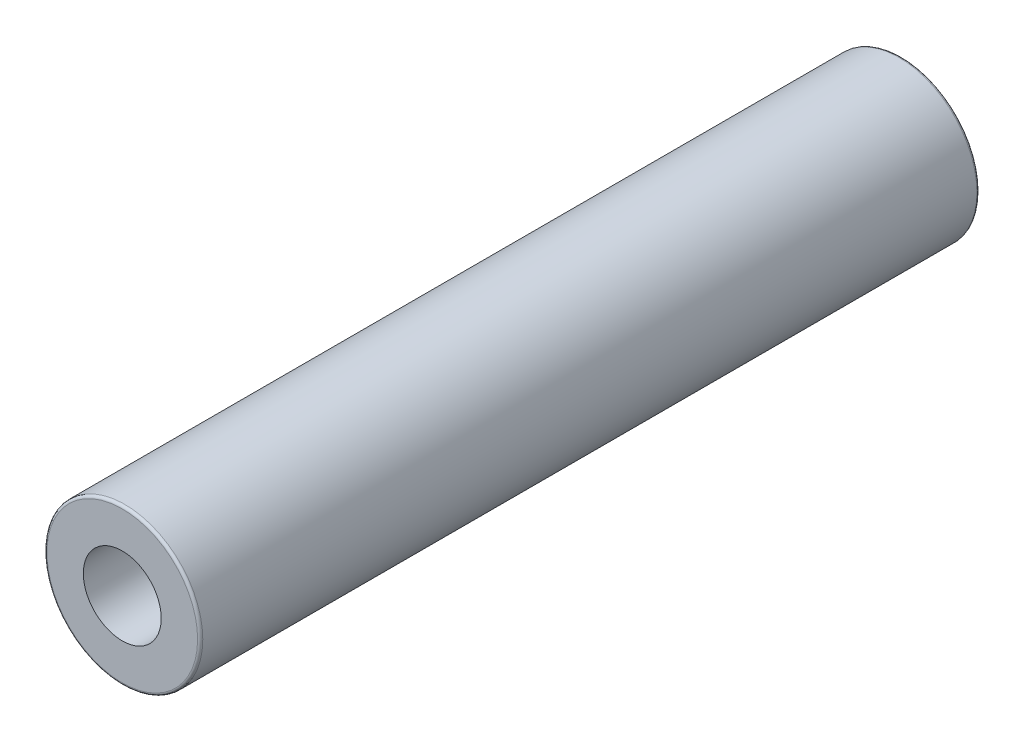
ISO-10303-21;
HEADER;
FILE_DESCRIPTION(('STEP AP214'),'2;1');
FILE_NAME('part.step','',(''),(''),'','','');
FILE_SCHEMA(('AUTOMOTIVE_DESIGN { 1 0 10303 214 1 1 1 1 }'));
ENDSEC;
DATA;
#1=APPLICATION_CONTEXT('core data for automotive mechanical design processes');
#2=APPLICATION_PROTOCOL_DEFINITION('international standard','automotive_design',2000,#1);
#3=PRODUCT_CONTEXT('',#1,'mechanical');
#4=PRODUCT('Part','Part','',(#3));
#5=PRODUCT_RELATED_PRODUCT_CATEGORY('part','',(#4));
#6=PRODUCT_DEFINITION_FORMATION('','',#4);
#7=PRODUCT_DEFINITION_CONTEXT('part definition',#1,'design');
#8=PRODUCT_DEFINITION('design','',#6,#7);
#9=PRODUCT_DEFINITION_SHAPE('','',#8);
#10=(LENGTH_UNIT() NAMED_UNIT(*) SI_UNIT(.MILLI.,.METRE.));
#11=(NAMED_UNIT(*) PLANE_ANGLE_UNIT() SI_UNIT($,.RADIAN.));
#12=(NAMED_UNIT(*) SI_UNIT($,.STERADIAN.) SOLID_ANGLE_UNIT());
#13=UNCERTAINTY_MEASURE_WITH_UNIT(LENGTH_MEASURE(1.E-05),#10,'distance_accuracy_value','');
#14=(GEOMETRIC_REPRESENTATION_CONTEXT(3) GLOBAL_UNCERTAINTY_ASSIGNED_CONTEXT((#13)) GLOBAL_UNIT_ASSIGNED_CONTEXT((#10,
#11,#12)) REPRESENTATION_CONTEXT('',''));
#15=CARTESIAN_POINT('',(0.,0.,0.));
#16=DIRECTION('',(0.,0.,1.));
#17=DIRECTION('',(1.,0.,0.));
#18=AXIS2_PLACEMENT_3D('',#15,#16,#17);
#19=CARTESIAN_POINT('',(0.,0.,30.));
#20=DIRECTION('',(0.,0.,1.));
#21=DIRECTION('',(1.,0.,0.));
#22=AXIS2_PLACEMENT_3D('',#19,#20,#21);
#23=PLANE('',#22);
#24=CARTESIAN_POINT('',(0.,0.,30.));
#25=DIRECTION('',(0.,0.,1.));
#26=DIRECTION('',(1.,0.,0.));
#27=AXIS2_PLACEMENT_3D('',#24,#25,#26);
#28=CIRCLE('',#27,2.9);
#29=CARTESIAN_POINT('',(2.9,0.,30.));
#30=VERTEX_POINT('',#29);
#31=EDGE_CURVE('E10',#30,#30,#28,.T.);
#32=ORIENTED_EDGE('',*,*,#31,.T.);
#33=EDGE_LOOP('',(#32));
#34=FACE_BOUND('',#33,.T.);
#35=CARTESIAN_POINT('',(0.,0.,30.));
#36=DIRECTION('',(0.,0.,1.));
#37=DIRECTION('',(1.,0.,0.));
#38=AXIS2_PLACEMENT_3D('',#35,#36,#37);
#39=CIRCLE('',#38,1.5);
#40=CARTESIAN_POINT('',(1.5,0.,30.));
#41=VERTEX_POINT('',#40);
#42=EDGE_CURVE('E51',#41,#41,#39,.T.);
#43=ORIENTED_EDGE('',*,*,#42,.F.);
#44=EDGE_LOOP('',(#43));
#45=FACE_BOUND('',#44,.T.);
#46=ADVANCED_FACE('F31',(#34,#45),#23,.T.);
#47=CARTESIAN_POINT('',(0.,0.,0.));
#48=DIRECTION('',(0.,0.,1.));
#49=DIRECTION('',(1.,0.,0.));
#50=AXIS2_PLACEMENT_3D('',#47,#48,#49);
#51=PLANE('',#50);
#52=CARTESIAN_POINT('',(0.,0.,0.));
#53=DIRECTION('',(0.,0.,1.));
#54=DIRECTION('',(1.,0.,0.));
#55=AXIS2_PLACEMENT_3D('',#52,#53,#54);
#56=CIRCLE('',#55,2.9);
#57=CARTESIAN_POINT('',(2.9,0.,0.));
#58=VERTEX_POINT('',#57);
#59=EDGE_CURVE('E38',#58,#58,#56,.F.);
#60=ORIENTED_EDGE('',*,*,#59,.T.);
#61=EDGE_LOOP('',(#60));
#62=FACE_BOUND('',#61,.T.);
#63=CARTESIAN_POINT('',(0.,0.,0.));
#64=DIRECTION('',(0.,0.,1.));
#65=DIRECTION('',(1.,0.,0.));
#66=AXIS2_PLACEMENT_3D('',#63,#64,#65);
#67=CIRCLE('',#66,1.5);
#68=CARTESIAN_POINT('',(1.5,0.,0.));
#69=VERTEX_POINT('',#68);
#70=EDGE_CURVE('E52',#69,#69,#67,.T.);
#71=ORIENTED_EDGE('',*,*,#70,.T.);
#72=EDGE_LOOP('',(#71));
#73=FACE_BOUND('',#72,.T.);
#74=ADVANCED_FACE('F62',(#62,#73),#51,.F.);
#75=CARTESIAN_POINT('',(0.,0.,30.));
#76=DIRECTION('',(0.,0.,-1.));
#77=DIRECTION('',(-1.,0.,0.));
#78=AXIS2_PLACEMENT_3D('',#75,#76,#77);
#79=CYLINDRICAL_SURFACE('',#78,3.);
#80=CARTESIAN_POINT('',(0.,0.,0.0999999999999994));
#81=DIRECTION('',(0.,0.,1.));
#82=DIRECTION('',(1.,0.,0.));
#83=AXIS2_PLACEMENT_3D('',#80,#81,#82);
#84=CIRCLE('',#83,3.);
#85=CARTESIAN_POINT('',(3.,0.,0.0999999999999994));
#86=VERTEX_POINT('',#85);
#87=EDGE_CURVE('E42',#86,#86,#84,.T.);
#88=ORIENTED_EDGE('',*,*,#87,.T.);
#89=EDGE_LOOP('',(#88));
#90=FACE_BOUND('',#89,.T.);
#91=CARTESIAN_POINT('',(0.,0.,29.9));
#92=DIRECTION('',(0.,0.,1.));
#93=DIRECTION('',(1.,0.,0.));
#94=AXIS2_PLACEMENT_3D('',#91,#92,#93);
#95=CIRCLE('',#94,3.);
#96=CARTESIAN_POINT('',(3.,0.,29.9));
#97=VERTEX_POINT('',#96);
#98=EDGE_CURVE('E46',#97,#97,#95,.F.);
#99=ORIENTED_EDGE('',*,*,#98,.T.);
#100=EDGE_LOOP('',(#99));
#101=FACE_BOUND('',#100,.T.);
#102=ADVANCED_FACE('F67',(#90,#101),#79,.T.);
#103=CARTESIAN_POINT('',(0.,0.,30.));
#104=DIRECTION('',(0.,0.,-1.));
#105=DIRECTION('',(-1.,0.,0.));
#106=AXIS2_PLACEMENT_3D('',#103,#104,#105);
#107=CYLINDRICAL_SURFACE('',#106,1.5);
#108=ORIENTED_EDGE('',*,*,#42,.T.);
#109=EDGE_LOOP('',(#108));
#110=FACE_BOUND('',#109,.T.);
#111=ORIENTED_EDGE('',*,*,#70,.F.);
#112=EDGE_LOOP('',(#111));
#113=FACE_BOUND('',#112,.T.);
#114=ADVANCED_FACE('F58',(#110,#113),#107,.F.);
#115=CARTESIAN_POINT('',(0.,0.,0.0999999999999994));
#116=DIRECTION('',(0.,0.,1.));
#117=DIRECTION('',(1.,0.,0.));
#118=AXIS2_PLACEMENT_3D('',#115,#116,#117);
#119=TOROIDAL_SURFACE('',#118,2.9,0.1);
#120=ORIENTED_EDGE('',*,*,#59,.F.);
#121=EDGE_LOOP('',(#120));
#122=FACE_BOUND('',#121,.T.);
#123=ORIENTED_EDGE('',*,*,#87,.F.);
#124=EDGE_LOOP('',(#123));
#125=FACE_BOUND('',#124,.T.);
#126=ADVANCED_FACE('F73',(#122,#125),#119,.T.);
#127=CARTESIAN_POINT('',(0.,0.,29.9));
#128=DIRECTION('',(0.,0.,1.));
#129=DIRECTION('',(1.,0.,0.));
#130=AXIS2_PLACEMENT_3D('',#127,#128,#129);
#131=TOROIDAL_SURFACE('',#130,2.9,0.1);
#132=ORIENTED_EDGE('',*,*,#98,.F.);
#133=EDGE_LOOP('',(#132));
#134=FACE_BOUND('',#133,.T.);
#135=ORIENTED_EDGE('',*,*,#31,.F.);
#136=EDGE_LOOP('',(#135));
#137=FACE_BOUND('',#136,.T.);
#138=ADVANCED_FACE('F33',(#134,#137),#131,.T.);
#139=CLOSED_SHELL('',(#46,#74,#102,#114,#126,#138));
#140=MANIFOLD_SOLID_BREP('B2',#139);
#141=ADVANCED_BREP_SHAPE_REPRESENTATION('',(#18,#140),#14);
#142=SHAPE_DEFINITION_REPRESENTATION(#9,#141);
ENDSEC;
END-ISO-10303-21;
